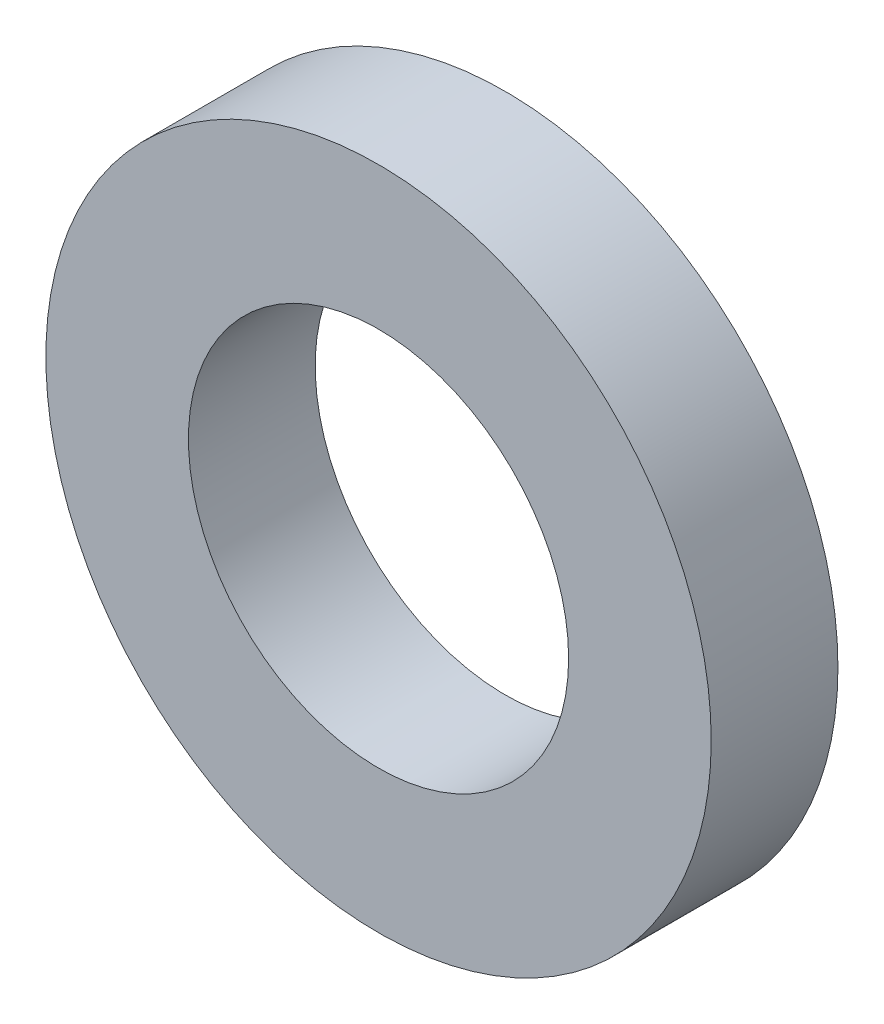
ISO-10303-21;
HEADER;
FILE_DESCRIPTION(('STEP AP214'),'2;1');
FILE_NAME('part.step','',(''),(''),'','','');
FILE_SCHEMA(('AUTOMOTIVE_DESIGN { 1 0 10303 214 1 1 1 1 }'));
ENDSEC;
DATA;
#1=APPLICATION_CONTEXT('core data for automotive mechanical design processes');
#2=APPLICATION_PROTOCOL_DEFINITION('international standard','automotive_design',2000,#1);
#3=PRODUCT_CONTEXT('',#1,'mechanical');
#4=PRODUCT('Part','Part','',(#3));
#5=PRODUCT_RELATED_PRODUCT_CATEGORY('part','',(#4));
#6=PRODUCT_DEFINITION_FORMATION('','',#4);
#7=PRODUCT_DEFINITION_CONTEXT('part definition',#1,'design');
#8=PRODUCT_DEFINITION('design','',#6,#7);
#9=PRODUCT_DEFINITION_SHAPE('','',#8);
#10=(LENGTH_UNIT() NAMED_UNIT(*) SI_UNIT(.MILLI.,.METRE.));
#11=(NAMED_UNIT(*) PLANE_ANGLE_UNIT() SI_UNIT($,.RADIAN.));
#12=(NAMED_UNIT(*) SI_UNIT($,.STERADIAN.) SOLID_ANGLE_UNIT());
#13=UNCERTAINTY_MEASURE_WITH_UNIT(LENGTH_MEASURE(1.E-05),#10,'distance_accuracy_value','');
#14=(GEOMETRIC_REPRESENTATION_CONTEXT(3) GLOBAL_UNCERTAINTY_ASSIGNED_CONTEXT((#13)) GLOBAL_UNIT_ASSIGNED_CONTEXT((#10,
#11,#12)) REPRESENTATION_CONTEXT('',''));
#15=CARTESIAN_POINT('',(0.,0.,0.));
#16=DIRECTION('',(0.,0.,1.));
#17=DIRECTION('',(1.,0.,0.));
#18=AXIS2_PLACEMENT_3D('',#15,#16,#17);
#19=CARTESIAN_POINT('',(0.,0.,2.));
#20=DIRECTION('',(0.,0.,-1.));
#21=DIRECTION('',(-1.,0.,0.));
#22=AXIS2_PLACEMENT_3D('',#19,#20,#21);
#23=CYLINDRICAL_SURFACE('',#22,5.25);
#24=CARTESIAN_POINT('',(0.,0.,2.));
#25=DIRECTION('',(0.,0.,1.));
#26=DIRECTION('',(1.,0.,0.));
#27=AXIS2_PLACEMENT_3D('',#24,#25,#26);
#28=CIRCLE('',#27,5.25);
#29=CARTESIAN_POINT('',(5.25,0.,2.));
#30=VERTEX_POINT('',#29);
#31=EDGE_CURVE('E10',#30,#30,#28,.T.);
#32=ORIENTED_EDGE('',*,*,#31,.F.);
#33=EDGE_LOOP('',(#32));
#34=FACE_BOUND('',#33,.T.);
#35=CARTESIAN_POINT('',(0.,0.,0.));
#36=DIRECTION('',(0.,0.,1.));
#37=DIRECTION('',(1.,0.,0.));
#38=AXIS2_PLACEMENT_3D('',#35,#36,#37);
#39=CIRCLE('',#38,5.25);
#40=CARTESIAN_POINT('',(5.25,0.,0.));
#41=VERTEX_POINT('',#40);
#42=EDGE_CURVE('E40',#41,#41,#39,.T.);
#43=ORIENTED_EDGE('',*,*,#42,.T.);
#44=EDGE_LOOP('',(#43));
#45=FACE_BOUND('',#44,.T.);
#46=ADVANCED_FACE('F37',(#34,#45),#23,.T.);
#47=CARTESIAN_POINT('',(0.,0.,2.));
#48=DIRECTION('',(0.,0.,1.));
#49=DIRECTION('',(1.,0.,0.));
#50=AXIS2_PLACEMENT_3D('',#47,#48,#49);
#51=PLANE('',#50);
#52=CARTESIAN_POINT('',(0.,0.,2.));
#53=DIRECTION('',(0.,0.,1.));
#54=DIRECTION('',(1.,0.,0.));
#55=AXIS2_PLACEMENT_3D('',#52,#53,#54);
#56=CIRCLE('',#55,3.);
#57=CARTESIAN_POINT('',(3.,0.,2.));
#58=VERTEX_POINT('',#57);
#59=EDGE_CURVE('E51',#58,#58,#56,.T.);
#60=ORIENTED_EDGE('',*,*,#59,.F.);
#61=EDGE_LOOP('',(#60));
#62=FACE_BOUND('',#61,.T.);
#63=ORIENTED_EDGE('',*,*,#31,.T.);
#64=EDGE_LOOP('',(#63));
#65=FACE_BOUND('',#64,.T.);
#66=ADVANCED_FACE('F68',(#62,#65),#51,.T.);
#67=CARTESIAN_POINT('',(0.,0.,0.));
#68=DIRECTION('',(0.,0.,1.));
#69=DIRECTION('',(1.,0.,0.));
#70=AXIS2_PLACEMENT_3D('',#67,#68,#69);
#71=PLANE('',#70);
#72=CARTESIAN_POINT('',(0.,0.,0.));
#73=DIRECTION('',(0.,0.,1.));
#74=DIRECTION('',(1.,0.,0.));
#75=AXIS2_PLACEMENT_3D('',#72,#73,#74);
#76=CIRCLE('',#75,3.);
#77=CARTESIAN_POINT('',(3.,0.,0.));
#78=VERTEX_POINT('',#77);
#79=EDGE_CURVE('E49',#78,#78,#76,.T.);
#80=ORIENTED_EDGE('',*,*,#79,.T.);
#81=EDGE_LOOP('',(#80));
#82=FACE_BOUND('',#81,.T.);
#83=ORIENTED_EDGE('',*,*,#42,.F.);
#84=EDGE_LOOP('',(#83));
#85=FACE_BOUND('',#84,.T.);
#86=ADVANCED_FACE('F59',(#82,#85),#71,.F.);
#87=CARTESIAN_POINT('',(0.,0.,0.));
#88=DIRECTION('',(0.,0.,1.));
#89=DIRECTION('',(1.,0.,0.));
#90=AXIS2_PLACEMENT_3D('',#87,#88,#89);
#91=CYLINDRICAL_SURFACE('',#90,3.);
#92=ORIENTED_EDGE('',*,*,#79,.F.);
#93=EDGE_LOOP('',(#92));
#94=FACE_BOUND('',#93,.T.);
#95=ORIENTED_EDGE('',*,*,#59,.T.);
#96=EDGE_LOOP('',(#95));
#97=FACE_BOUND('',#96,.T.);
#98=ADVANCED_FACE('F62',(#94,#97),#91,.F.);
#99=CLOSED_SHELL('',(#46,#66,#86,#98));
#100=MANIFOLD_SOLID_BREP('B2',#99);
#101=ADVANCED_BREP_SHAPE_REPRESENTATION('',(#18,#100),#14);
#102=SHAPE_DEFINITION_REPRESENTATION(#9,#101);
ENDSEC;
END-ISO-10303-21;
